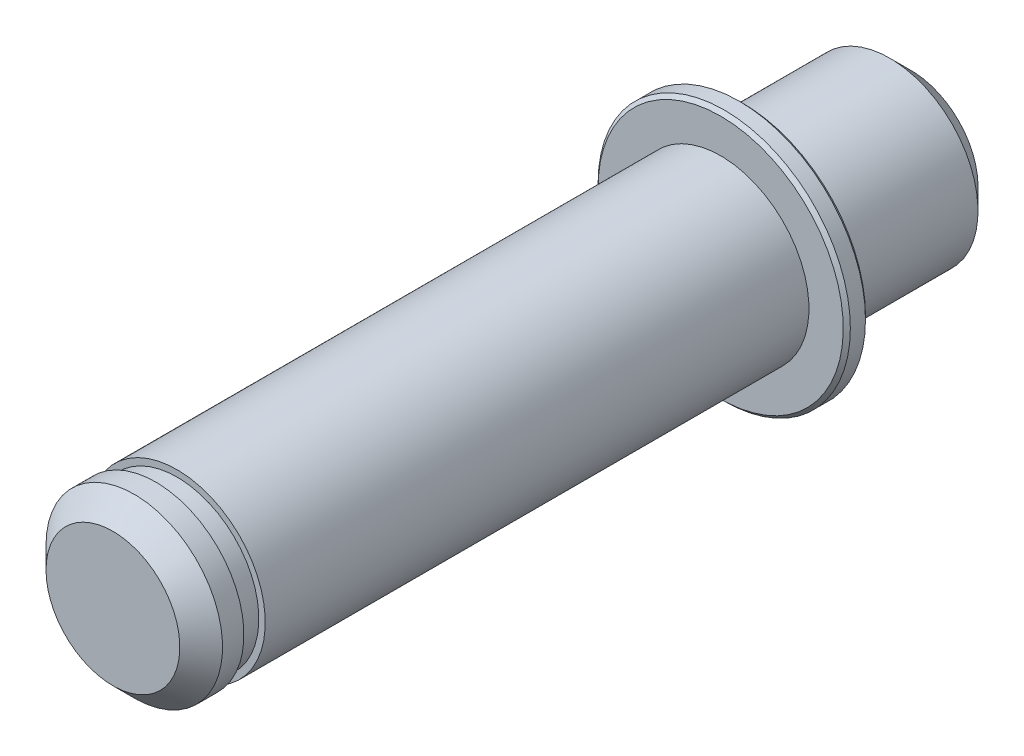
ISO-10303-21;
HEADER;
FILE_DESCRIPTION(('STEP AP214'),'2;1');
FILE_NAME('part.step','',(''),(''),'','','');
FILE_SCHEMA(('AUTOMOTIVE_DESIGN { 1 0 10303 214 1 1 1 1 }'));
ENDSEC;
DATA;
#1=APPLICATION_CONTEXT('core data for automotive mechanical design processes');
#2=APPLICATION_PROTOCOL_DEFINITION('international standard','automotive_design',2000,#1);
#3=PRODUCT_CONTEXT('',#1,'mechanical');
#4=PRODUCT('Part','Part','',(#3));
#5=PRODUCT_RELATED_PRODUCT_CATEGORY('part','',(#4));
#6=PRODUCT_DEFINITION_FORMATION('','',#4);
#7=PRODUCT_DEFINITION_CONTEXT('part definition',#1,'design');
#8=PRODUCT_DEFINITION('design','',#6,#7);
#9=PRODUCT_DEFINITION_SHAPE('','',#8);
#10=(LENGTH_UNIT() NAMED_UNIT(*) SI_UNIT(.MILLI.,.METRE.));
#11=(NAMED_UNIT(*) PLANE_ANGLE_UNIT() SI_UNIT($,.RADIAN.));
#12=(NAMED_UNIT(*) SI_UNIT($,.STERADIAN.) SOLID_ANGLE_UNIT());
#13=UNCERTAINTY_MEASURE_WITH_UNIT(LENGTH_MEASURE(1.E-05),#10,'distance_accuracy_value','');
#14=(GEOMETRIC_REPRESENTATION_CONTEXT(3) GLOBAL_UNCERTAINTY_ASSIGNED_CONTEXT((#13)) GLOBAL_UNIT_ASSIGNED_CONTEXT((#10,
#11,#12)) REPRESENTATION_CONTEXT('',''));
#15=CARTESIAN_POINT('',(0.,0.,0.));
#16=DIRECTION('',(0.,0.,1.));
#17=DIRECTION('',(1.,0.,0.));
#18=AXIS2_PLACEMENT_3D('',#15,#16,#17);
#19=CARTESIAN_POINT('',(-3.1496,0.,-13.0965));
#20=DIRECTION('',(0.,0.,-1.));
#21=DIRECTION('',(-1.,0.,0.));
#22=AXIS2_PLACEMENT_3D('',#19,#20,#21);
#23=PLANE('',#22);
#24=CARTESIAN_POINT('',(0.,0.,-13.0965000000742));
#25=DIRECTION('',(0.,0.,1.));
#26=DIRECTION('',(0.,-1.,0.));
#27=AXIS2_PLACEMENT_3D('',#24,#25,#26);
#28=CIRCLE('',#27,2.38759999996318);
#29=CARTESIAN_POINT('',(0.,-2.38759999996318,-13.0965000000742));
#30=VERTEX_POINT('',#29);
#31=EDGE_CURVE('E18',#30,#30,#28,.T.);
#32=ORIENTED_EDGE('',*,*,#31,.F.);
#33=EDGE_LOOP('',(#32));
#34=FACE_BOUND('',#33,.T.);
#35=ADVANCED_FACE('F15',(#34),#23,.T.);
#36=CARTESIAN_POINT('',(0.,0.,-12.3345000000086));
#37=DIRECTION('',(0.,0.,1.));
#38=DIRECTION('',(0.,-1.,0.));
#39=AXIS2_PLACEMENT_3D('',#36,#37,#38);
#40=CONICAL_SURFACE('',#39,3.14960000002884,0.785398163397448);
#41=ORIENTED_EDGE('',*,*,#31,.T.);
#42=EDGE_LOOP('',(#41));
#43=FACE_BOUND('',#42,.T.);
#44=CARTESIAN_POINT('',(0.,0.,-12.3345));
#45=DIRECTION('',(0.,0.,-1.));
#46=DIRECTION('',(-1.,0.,0.));
#47=AXIS2_PLACEMENT_3D('',#44,#45,#46);
#48=CIRCLE('',#47,3.1496);
#49=CARTESIAN_POINT('',(-3.1496,0.,-12.3345));
#50=VERTEX_POINT('',#49);
#51=EDGE_CURVE('E30',#50,#50,#48,.F.);
#52=ORIENTED_EDGE('',*,*,#51,.F.);
#53=EDGE_LOOP('',(#52));
#54=FACE_BOUND('',#53,.T.);
#55=ADVANCED_FACE('F62',(#43,#54),#40,.T.);
#56=CARTESIAN_POINT('',(0.,0.,15.3825));
#57=DIRECTION('',(0.,0.,1.));
#58=DIRECTION('',(1.,0.,0.));
#59=AXIS2_PLACEMENT_3D('',#56,#57,#58);
#60=PLANE('',#59);
#61=CARTESIAN_POINT('',(0.,0.,15.382499999987));
#62=DIRECTION('',(0.,0.,-1.));
#63=DIRECTION('',(-1.,0.,0.));
#64=AXIS2_PLACEMENT_3D('',#61,#62,#63);
#65=CIRCLE('',#64,2.38760000007687);
#66=CARTESIAN_POINT('',(-2.38760000007687,0.,15.382499999987));
#67=VERTEX_POINT('',#66);
#68=EDGE_CURVE('E52',#67,#67,#65,.T.);
#69=ORIENTED_EDGE('',*,*,#68,.F.);
#70=EDGE_LOOP('',(#69));
#71=FACE_BOUND('',#70,.T.);
#72=ADVANCED_FACE('F70',(#71),#60,.T.);
#73=CARTESIAN_POINT('',(0.,0.,-13.0965));
#74=DIRECTION('',(0.,0.,-1.));
#75=DIRECTION('',(-1.,0.,0.));
#76=AXIS2_PLACEMENT_3D('',#73,#74,#75);
#77=CYLINDRICAL_SURFACE('',#76,3.1496);
#78=CARTESIAN_POINT('',(0.,0.,-7.0965));
#79=DIRECTION('',(0.,0.,-1.));
#80=DIRECTION('',(-1.,0.,0.));
#81=AXIS2_PLACEMENT_3D('',#78,#79,#80);
#82=CIRCLE('',#81,3.1496);
#83=CARTESIAN_POINT('',(-3.1496,0.,-7.0965));
#84=VERTEX_POINT('',#83);
#85=EDGE_CURVE('E50',#84,#84,#82,.F.);
#86=ORIENTED_EDGE('',*,*,#85,.F.);
#87=EDGE_LOOP('',(#86));
#88=FACE_BOUND('',#87,.T.);
#89=ORIENTED_EDGE('',*,*,#51,.T.);
#90=EDGE_LOOP('',(#89));
#91=FACE_BOUND('',#90,.T.);
#92=ADVANCED_FACE('F117',(#88,#91),#77,.T.);
#93=CARTESIAN_POINT('',(0.,0.,14.6205000001487));
#94=DIRECTION('',(0.,0.,-1.));
#95=DIRECTION('',(-1.,0.,0.));
#96=AXIS2_PLACEMENT_3D('',#93,#94,#95);
#97=CONICAL_SURFACE('',#96,3.14959999991515,0.785398163397448);
#98=ORIENTED_EDGE('',*,*,#68,.T.);
#99=EDGE_LOOP('',(#98));
#100=FACE_BOUND('',#99,.T.);
#101=CARTESIAN_POINT('',(0.,0.,14.6205));
#102=DIRECTION('',(0.,0.,-1.));
#103=DIRECTION('',(-1.,0.,0.));
#104=AXIS2_PLACEMENT_3D('',#101,#102,#103);
#105=CIRCLE('',#104,3.1496);
#106=CARTESIAN_POINT('',(-3.1496,0.,14.6205));
#107=VERTEX_POINT('',#106);
#108=EDGE_CURVE('E49',#107,#107,#105,.T.);
#109=ORIENTED_EDGE('',*,*,#108,.F.);
#110=EDGE_LOOP('',(#109));
#111=FACE_BOUND('',#110,.T.);
#112=ADVANCED_FACE('F113',(#100,#111),#97,.T.);
#113=CARTESIAN_POINT('',(-4.5,0.,-7.0965));
#114=DIRECTION('',(0.,0.,-1.));
#115=DIRECTION('',(-1.,0.,0.));
#116=AXIS2_PLACEMENT_3D('',#113,#114,#115);
#117=PLANE('',#116);
#118=ORIENTED_EDGE('',*,*,#85,.T.);
#119=EDGE_LOOP('',(#118));
#120=FACE_BOUND('',#119,.T.);
#121=CARTESIAN_POINT('',(0.,0.,-7.09650000004558));
#122=DIRECTION('',(0.,0.,1.));
#123=DIRECTION('',(1.,0.,0.));
#124=AXIS2_PLACEMENT_3D('',#121,#122,#123);
#125=CIRCLE('',#124,4.3730000000437);
#126=CARTESIAN_POINT('',(4.3730000000437,0.,-7.09650000004558));
#127=VERTEX_POINT('',#126);
#128=EDGE_CURVE('E46',#127,#127,#125,.T.);
#129=ORIENTED_EDGE('',*,*,#128,.F.);
#130=EDGE_LOOP('',(#129));
#131=FACE_BOUND('',#130,.T.);
#132=ADVANCED_FACE('F109',(#120,#131),#117,.T.);
#133=CARTESIAN_POINT('',(0.,0.,15.3825));
#134=DIRECTION('',(0.,0.,-1.));
#135=DIRECTION('',(-1.,0.,0.));
#136=AXIS2_PLACEMENT_3D('',#133,#134,#135);
#137=CYLINDRICAL_SURFACE('',#136,3.1496);
#138=ORIENTED_EDGE('',*,*,#108,.T.);
#139=EDGE_LOOP('',(#138));
#140=FACE_BOUND('',#139,.T.);
#141=CARTESIAN_POINT('',(0.,0.,13.8585));
#142=DIRECTION('',(0.,0.,-1.));
#143=DIRECTION('',(-1.,0.,0.));
#144=AXIS2_PLACEMENT_3D('',#141,#142,#143);
#145=CIRCLE('',#144,3.1496);
#146=CARTESIAN_POINT('',(-3.1496,0.,13.8585));
#147=VERTEX_POINT('',#146);
#148=EDGE_CURVE('E43',#147,#147,#145,.F.);
#149=ORIENTED_EDGE('',*,*,#148,.T.);
#150=EDGE_LOOP('',(#149));
#151=FACE_BOUND('',#150,.T.);
#152=ADVANCED_FACE('F105',(#140,#151),#137,.T.);
#153=CARTESIAN_POINT('',(0.,0.,-6.96950000008201));
#154=DIRECTION('',(0.,0.,1.));
#155=DIRECTION('',(1.,0.,0.));
#156=AXIS2_PLACEMENT_3D('',#153,#154,#155);
#157=CONICAL_SURFACE('',#156,4.49999999995043,0.785398163173655);
#158=CARTESIAN_POINT('',(0.,0.,-6.9695));
#159=DIRECTION('',(0.,0.,-1.));
#160=DIRECTION('',(-1.,0.,0.));
#161=AXIS2_PLACEMENT_3D('',#158,#159,#160);
#162=CIRCLE('',#161,4.5);
#163=CARTESIAN_POINT('',(-4.5,0.,-6.9695));
#164=VERTEX_POINT('',#163);
#165=EDGE_CURVE('E42',#164,#164,#162,.F.);
#166=ORIENTED_EDGE('',*,*,#165,.F.);
#167=EDGE_LOOP('',(#166));
#168=FACE_BOUND('',#167,.T.);
#169=ORIENTED_EDGE('',*,*,#128,.T.);
#170=EDGE_LOOP('',(#169));
#171=FACE_BOUND('',#170,.T.);
#172=ADVANCED_FACE('F101',(#168,#171),#157,.T.);
#173=CARTESIAN_POINT('',(0.,0.,13.8585));
#174=DIRECTION('',(0.,0.,1.));
#175=DIRECTION('',(1.,0.,0.));
#176=AXIS2_PLACEMENT_3D('',#173,#174,#175);
#177=PLANE('',#176);
#178=ORIENTED_EDGE('',*,*,#148,.F.);
#179=EDGE_LOOP('',(#178));
#180=FACE_BOUND('',#179,.T.);
#181=CARTESIAN_POINT('',(0.,0.,13.8585));
#182=DIRECTION('',(0.,0.,-1.));
#183=DIRECTION('',(-1.,0.,0.));
#184=AXIS2_PLACEMENT_3D('',#181,#182,#183);
#185=CIRCLE('',#184,2.921);
#186=CARTESIAN_POINT('',(-2.921,0.,13.8585));
#187=VERTEX_POINT('',#186);
#188=EDGE_CURVE('E39',#187,#187,#185,.T.);
#189=ORIENTED_EDGE('',*,*,#188,.F.);
#190=EDGE_LOOP('',(#189));
#191=FACE_BOUND('',#190,.T.);
#192=ADVANCED_FACE('F97',(#180,#191),#177,.F.);
#193=CARTESIAN_POINT('',(0.,0.,-13.0965));
#194=DIRECTION('',(0.,0.,-1.));
#195=DIRECTION('',(-1.,0.,0.));
#196=AXIS2_PLACEMENT_3D('',#193,#194,#195);
#197=CYLINDRICAL_SURFACE('',#196,4.5);
#198=ORIENTED_EDGE('',*,*,#165,.T.);
#199=EDGE_LOOP('',(#198));
#200=FACE_BOUND('',#199,.T.);
#201=CARTESIAN_POINT('',(0.,0.,-6.42974999999524));
#202=DIRECTION('',(0.,0.,-1.));
#203=DIRECTION('',(-1.,0.,0.));
#204=AXIS2_PLACEMENT_3D('',#201,#202,#203);
#205=CIRCLE('',#204,4.50000000006412);
#206=CARTESIAN_POINT('',(-4.50000000006412,0.,-6.42974999999524));
#207=VERTEX_POINT('',#206);
#208=EDGE_CURVE('E38',#207,#207,#205,.F.);
#209=ORIENTED_EDGE('',*,*,#208,.F.);
#210=EDGE_LOOP('',(#209));
#211=FACE_BOUND('',#210,.T.);
#212=ADVANCED_FACE('F93',(#200,#211),#197,.T.);
#213=CARTESIAN_POINT('',(0.,0.,13.8585));
#214=DIRECTION('',(0.,0.,-1.));
#215=DIRECTION('',(-1.,0.,0.));
#216=AXIS2_PLACEMENT_3D('',#213,#214,#215);
#217=CYLINDRICAL_SURFACE('',#216,2.921);
#218=CARTESIAN_POINT('',(0.,0.,13.0965));
#219=DIRECTION('',(0.,0.,-1.));
#220=DIRECTION('',(-1.,0.,0.));
#221=AXIS2_PLACEMENT_3D('',#218,#219,#220);
#222=CIRCLE('',#221,2.921);
#223=CARTESIAN_POINT('',(-2.921,0.,13.0965));
#224=VERTEX_POINT('',#223);
#225=EDGE_CURVE('E35',#224,#224,#222,.T.);
#226=ORIENTED_EDGE('',*,*,#225,.F.);
#227=EDGE_LOOP('',(#226));
#228=FACE_BOUND('',#227,.T.);
#229=ORIENTED_EDGE('',*,*,#188,.T.);
#230=EDGE_LOOP('',(#229));
#231=FACE_BOUND('',#230,.T.);
#232=ADVANCED_FACE('F89',(#228,#231),#217,.T.);
#233=CARTESIAN_POINT('',(0.,0.,-6.42974999993839));
#234=DIRECTION('',(0.,0.,-1.));
#235=DIRECTION('',(0.,1.,0.));
#236=AXIS2_PLACEMENT_3D('',#233,#234,#235);
#237=CONICAL_SURFACE('',#236,4.49999999995044,0.785398163173655);
#238=ORIENTED_EDGE('',*,*,#208,.T.);
#239=EDGE_LOOP('',(#238));
#240=FACE_BOUND('',#239,.T.);
#241=CARTESIAN_POINT('',(0.,0.,-6.30275000003166));
#242=DIRECTION('',(0.,0.,-1.));
#243=DIRECTION('',(0.,1.,0.));
#244=AXIS2_PLACEMENT_3D('',#241,#242,#243);
#245=CIRCLE('',#244,4.37300000010055);
#246=CARTESIAN_POINT('',(0.,4.37300000010055,-6.30275000003166));
#247=VERTEX_POINT('',#246);
#248=EDGE_CURVE('E27',#247,#247,#245,.F.);
#249=ORIENTED_EDGE('',*,*,#248,.F.);
#250=EDGE_LOOP('',(#249));
#251=FACE_BOUND('',#250,.T.);
#252=ADVANCED_FACE('F85',(#240,#251),#237,.T.);
#253=CARTESIAN_POINT('',(0.,0.,13.0965));
#254=DIRECTION('',(0.,0.,1.));
#255=DIRECTION('',(1.,0.,0.));
#256=AXIS2_PLACEMENT_3D('',#253,#254,#255);
#257=PLANE('',#256);
#258=CARTESIAN_POINT('',(0.,0.,13.0965));
#259=DIRECTION('',(0.,0.,-1.));
#260=DIRECTION('',(-1.,0.,0.));
#261=AXIS2_PLACEMENT_3D('',#258,#259,#260);
#262=CIRCLE('',#261,3.1496);
#263=CARTESIAN_POINT('',(-3.1496,0.,13.0965));
#264=VERTEX_POINT('',#263);
#265=EDGE_CURVE('E22',#264,#264,#262,.T.);
#266=ORIENTED_EDGE('',*,*,#265,.F.);
#267=EDGE_LOOP('',(#266));
#268=FACE_BOUND('',#267,.T.);
#269=ORIENTED_EDGE('',*,*,#225,.T.);
#270=EDGE_LOOP('',(#269));
#271=FACE_BOUND('',#270,.T.);
#272=ADVANCED_FACE('F78',(#268,#271),#257,.T.);
#273=CARTESIAN_POINT('',(-3.1496,0.,-6.30275));
#274=DIRECTION('',(0.,0.,1.));
#275=DIRECTION('',(1.,0.,0.));
#276=AXIS2_PLACEMENT_3D('',#273,#274,#275);
#277=PLANE('',#276);
#278=CARTESIAN_POINT('',(0.,0.,-6.30275));
#279=DIRECTION('',(0.,0.,-1.));
#280=DIRECTION('',(-1.,0.,0.));
#281=AXIS2_PLACEMENT_3D('',#278,#279,#280);
#282=CIRCLE('',#281,3.1496);
#283=CARTESIAN_POINT('',(-3.1496,0.,-6.30275));
#284=VERTEX_POINT('',#283);
#285=EDGE_CURVE('E10',#284,#284,#282,.F.);
#286=ORIENTED_EDGE('',*,*,#285,.F.);
#287=EDGE_LOOP('',(#286));
#288=FACE_BOUND('',#287,.T.);
#289=ORIENTED_EDGE('',*,*,#248,.T.);
#290=EDGE_LOOP('',(#289));
#291=FACE_BOUND('',#290,.T.);
#292=ADVANCED_FACE('F73',(#288,#291),#277,.T.);
#293=CARTESIAN_POINT('',(0.,0.,-13.0965));
#294=DIRECTION('',(0.,0.,-1.));
#295=DIRECTION('',(-1.,0.,0.));
#296=AXIS2_PLACEMENT_3D('',#293,#294,#295);
#297=CYLINDRICAL_SURFACE('',#296,3.1496);
#298=ORIENTED_EDGE('',*,*,#285,.T.);
#299=EDGE_LOOP('',(#298));
#300=FACE_BOUND('',#299,.T.);
#301=ORIENTED_EDGE('',*,*,#265,.T.);
#302=EDGE_LOOP('',(#301));
#303=FACE_BOUND('',#302,.T.);
#304=ADVANCED_FACE('F71',(#300,#303),#297,.T.);
#305=CLOSED_SHELL('',(#35,#55,#72,#92,#112,#132,#152,#172,#192,#212,#232,#252,#272,#292,#304));
#306=MANIFOLD_SOLID_BREP('B1',#305);
#307=ADVANCED_BREP_SHAPE_REPRESENTATION('',(#18,#306),#14);
#308=SHAPE_DEFINITION_REPRESENTATION(#9,#307);
ENDSEC;
END-ISO-10303-21;
